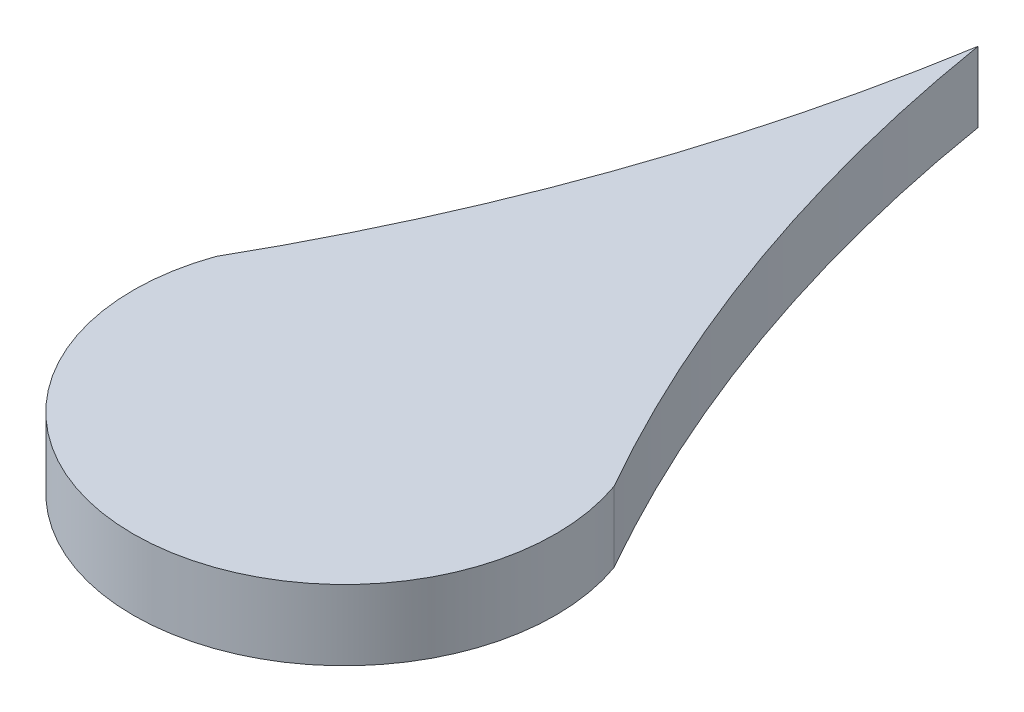
ISO-10303-21;
HEADER;
FILE_DESCRIPTION(('STEP AP214'),'2;1');
FILE_NAME('part.step','',(''),(''),'','','');
FILE_SCHEMA(('AUTOMOTIVE_DESIGN { 1 0 10303 214 1 1 1 1 }'));
ENDSEC;
DATA;
#1=APPLICATION_CONTEXT('core data for automotive mechanical design processes');
#2=APPLICATION_PROTOCOL_DEFINITION('international standard','automotive_design',2000,#1);
#3=PRODUCT_CONTEXT('',#1,'mechanical');
#4=PRODUCT('Part','Part','',(#3));
#5=PRODUCT_RELATED_PRODUCT_CATEGORY('part','',(#4));
#6=PRODUCT_DEFINITION_FORMATION('','',#4);
#7=PRODUCT_DEFINITION_CONTEXT('part definition',#1,'design');
#8=PRODUCT_DEFINITION('design','',#6,#7);
#9=PRODUCT_DEFINITION_SHAPE('','',#8);
#10=(LENGTH_UNIT() NAMED_UNIT(*) SI_UNIT(.MILLI.,.METRE.));
#11=(NAMED_UNIT(*) PLANE_ANGLE_UNIT() SI_UNIT($,.RADIAN.));
#12=(NAMED_UNIT(*) SI_UNIT($,.STERADIAN.) SOLID_ANGLE_UNIT());
#13=UNCERTAINTY_MEASURE_WITH_UNIT(LENGTH_MEASURE(1.E-05),#10,'distance_accuracy_value','');
#14=(GEOMETRIC_REPRESENTATION_CONTEXT(3) GLOBAL_UNCERTAINTY_ASSIGNED_CONTEXT((#13)) GLOBAL_UNIT_ASSIGNED_CONTEXT((#10,
#11,#12)) REPRESENTATION_CONTEXT('',''));
#15=CARTESIAN_POINT('',(0.,0.,0.));
#16=DIRECTION('',(0.,0.,1.));
#17=DIRECTION('',(1.,0.,0.));
#18=AXIS2_PLACEMENT_3D('',#15,#16,#17);
#19=CARTESIAN_POINT('',(-150.401470936952,6.35,-81.749949999975));
#20=DIRECTION('',(0.,-1.,0.));
#21=DIRECTION('',(0.,0.,-1.));
#22=AXIS2_PLACEMENT_3D('',#19,#20,#21);
#23=CYLINDRICAL_SURFACE('',#22,152.4);
#24=CARTESIAN_POINT('',(-150.401470936952,0.,-81.749949999975));
#25=DIRECTION('',(0.,-1.,0.));
#26=DIRECTION('',(0.,0.,1.));
#27=AXIS2_PLACEMENT_3D('',#24,#25,#26);
#28=CIRCLE('',#27,152.4);
#29=CARTESIAN_POINT('',(0.,0.,-57.1499999999999));
#30=VERTEX_POINT('',#29);
#31=CARTESIAN_POINT('',(-17.9605122421383,0.,-6.35));
#32=VERTEX_POINT('',#31);
#33=EDGE_CURVE('E89',#30,#32,#28,.T.);
#34=ORIENTED_EDGE('',*,*,#33,.T.);
#35=DIRECTION('',(0.,-1.,0.));
#36=VECTOR('',#35,1.);
#37=CARTESIAN_POINT('',(-17.9605122421383,6.35,-6.35));
#38=LINE('',#37,#36);
#39=CARTESIAN_POINT('',(-17.9605122421383,6.35,-6.35));
#40=VERTEX_POINT('',#39);
#41=EDGE_CURVE('E11',#40,#32,#38,.T.);
#42=ORIENTED_EDGE('',*,*,#41,.F.);
#43=CARTESIAN_POINT('',(-150.401470936952,6.35,-81.749949999975));
#44=DIRECTION('',(0.,-1.,0.));
#45=DIRECTION('',(0.,0.,1.));
#46=AXIS2_PLACEMENT_3D('',#43,#44,#45);
#47=CIRCLE('',#46,152.4);
#48=CARTESIAN_POINT('',(0.,6.35,-57.1499999999999));
#49=VERTEX_POINT('',#48);
#50=EDGE_CURVE('E81',#49,#40,#47,.T.);
#51=ORIENTED_EDGE('',*,*,#50,.F.);
#52=DIRECTION('',(0.,-1.,0.));
#53=VECTOR('',#52,1.);
#54=CARTESIAN_POINT('',(0.,6.35,-57.1499999999999));
#55=LINE('',#54,#53);
#56=EDGE_CURVE('E90',#49,#30,#55,.T.);
#57=ORIENTED_EDGE('',*,*,#56,.T.);
#58=EDGE_LOOP('',(#34,#42,#51,#57));
#59=FACE_BOUND('',#58,.T.);
#60=ADVANCED_FACE('F39',(#59),#23,.F.);
#61=CARTESIAN_POINT('',(0.,6.35,0.));
#62=DIRECTION('',(0.,-1.,0.));
#63=DIRECTION('',(0.,0.,-1.));
#64=AXIS2_PLACEMENT_3D('',#61,#62,#63);
#65=CYLINDRICAL_SURFACE('',#64,19.05);
#66=CARTESIAN_POINT('',(0.,0.,0.));
#67=DIRECTION('',(0.,1.,0.));
#68=DIRECTION('',(0.,0.,1.));
#69=AXIS2_PLACEMENT_3D('',#66,#67,#68);
#70=CIRCLE('',#69,19.05);
#71=CARTESIAN_POINT('',(17.9605122421383,0.,-6.35000000000002));
#72=VERTEX_POINT('',#71);
#73=EDGE_CURVE('E68',#32,#72,#70,.T.);
#74=ORIENTED_EDGE('',*,*,#73,.T.);
#75=DIRECTION('',(0.,-1.,0.));
#76=VECTOR('',#75,1.);
#77=CARTESIAN_POINT('',(17.9605122421383,6.35,-6.35000000000002));
#78=LINE('',#77,#76);
#79=CARTESIAN_POINT('',(17.9605122421383,6.35,-6.35000000000002));
#80=VERTEX_POINT('',#79);
#81=EDGE_CURVE('E48',#80,#72,#78,.T.);
#82=ORIENTED_EDGE('',*,*,#81,.F.);
#83=CARTESIAN_POINT('',(0.,6.35,0.));
#84=DIRECTION('',(0.,1.,0.));
#85=DIRECTION('',(0.,0.,1.));
#86=AXIS2_PLACEMENT_3D('',#83,#84,#85);
#87=CIRCLE('',#86,19.05);
#88=EDGE_CURVE('E76',#40,#80,#87,.T.);
#89=ORIENTED_EDGE('',*,*,#88,.F.);
#90=ORIENTED_EDGE('',*,*,#41,.T.);
#91=EDGE_LOOP('',(#74,#82,#89,#90));
#92=FACE_BOUND('',#91,.T.);
#93=ADVANCED_FACE('F77',(#92),#65,.T.);
#94=CARTESIAN_POINT('',(150.401470936952,6.35,-81.749949999975));
#95=DIRECTION('',(0.,-1.,0.));
#96=DIRECTION('',(0.,0.,-1.));
#97=AXIS2_PLACEMENT_3D('',#94,#95,#96);
#98=CYLINDRICAL_SURFACE('',#97,152.4);
#99=CARTESIAN_POINT('',(150.401470936952,0.,-81.749949999975));
#100=DIRECTION('',(0.,-1.,0.));
#101=DIRECTION('',(0.,0.,-1.));
#102=AXIS2_PLACEMENT_3D('',#99,#100,#101);
#103=CIRCLE('',#102,152.4);
#104=EDGE_CURVE('E73',#72,#30,#103,.T.);
#105=ORIENTED_EDGE('',*,*,#104,.T.);
#106=ORIENTED_EDGE('',*,*,#56,.F.);
#107=CARTESIAN_POINT('',(150.401470936952,6.35,-81.749949999975));
#108=DIRECTION('',(0.,-1.,0.));
#109=DIRECTION('',(0.,0.,-1.));
#110=AXIS2_PLACEMENT_3D('',#107,#108,#109);
#111=CIRCLE('',#110,152.4);
#112=EDGE_CURVE('E56',#80,#49,#111,.T.);
#113=ORIENTED_EDGE('',*,*,#112,.F.);
#114=ORIENTED_EDGE('',*,*,#81,.T.);
#115=EDGE_LOOP('',(#105,#106,#113,#114));
#116=FACE_BOUND('',#115,.T.);
#117=ADVANCED_FACE('F102',(#116),#98,.F.);
#118=CARTESIAN_POINT('',(0.,6.35,-81.749949999975));
#119=DIRECTION('',(0.,1.,0.));
#120=DIRECTION('',(0.,0.,1.));
#121=AXIS2_PLACEMENT_3D('',#118,#119,#120);
#122=PLANE('',#121);
#123=ORIENTED_EDGE('',*,*,#50,.T.);
#124=ORIENTED_EDGE('',*,*,#88,.T.);
#125=ORIENTED_EDGE('',*,*,#112,.T.);
#126=EDGE_LOOP('',(#123,#124,#125));
#127=FACE_BOUND('',#126,.T.);
#128=ADVANCED_FACE('F84',(#127),#122,.T.);
#129=CARTESIAN_POINT('',(0.,0.,-81.749949999975));
#130=DIRECTION('',(0.,1.,0.));
#131=DIRECTION('',(0.,0.,1.));
#132=AXIS2_PLACEMENT_3D('',#129,#130,#131);
#133=PLANE('',#132);
#134=ORIENTED_EDGE('',*,*,#33,.F.);
#135=ORIENTED_EDGE('',*,*,#104,.F.);
#136=ORIENTED_EDGE('',*,*,#73,.F.);
#137=EDGE_LOOP('',(#134,#135,#136));
#138=FACE_BOUND('',#137,.T.);
#139=ADVANCED_FACE('F103',(#138),#133,.F.);
#140=CLOSED_SHELL('',(#60,#93,#117,#128,#139));
#141=MANIFOLD_SOLID_BREP('B2',#140);
#142=ADVANCED_BREP_SHAPE_REPRESENTATION('',(#18,#141),#14);
#143=SHAPE_DEFINITION_REPRESENTATION(#9,#142);
ENDSEC;
END-ISO-10303-21;
